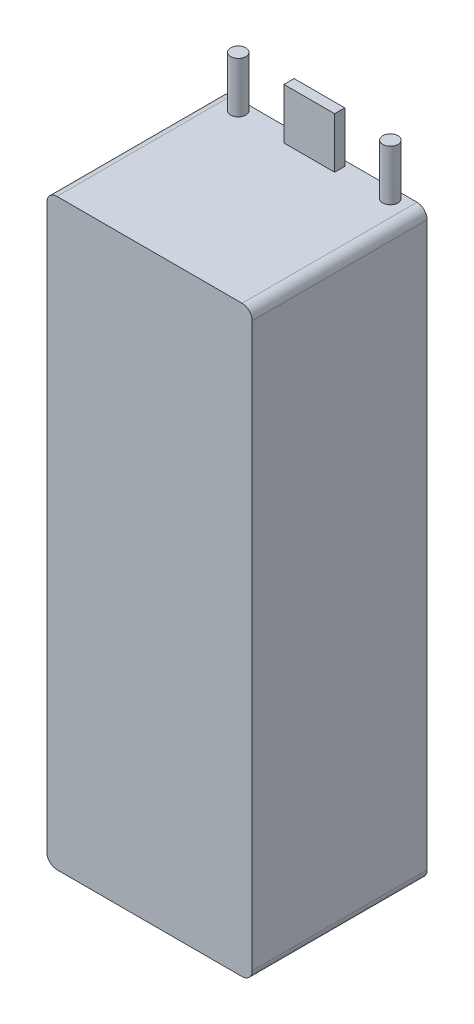
ISO-10303-21;
HEADER;
FILE_DESCRIPTION(('STEP AP214'),'2;1');
FILE_NAME('part.step','',(''),(''),'','','');
FILE_SCHEMA(('AUTOMOTIVE_DESIGN { 1 0 10303 214 1 1 1 1 }'));
ENDSEC;
DATA;
#1=APPLICATION_CONTEXT('core data for automotive mechanical design processes');
#2=APPLICATION_PROTOCOL_DEFINITION('international standard','automotive_design',2000,#1);
#3=PRODUCT_CONTEXT('',#1,'mechanical');
#4=PRODUCT('Part','Part','',(#3));
#5=PRODUCT_RELATED_PRODUCT_CATEGORY('part','',(#4));
#6=PRODUCT_DEFINITION_FORMATION('','',#4);
#7=PRODUCT_DEFINITION_CONTEXT('part definition',#1,'design');
#8=PRODUCT_DEFINITION('design','',#6,#7);
#9=PRODUCT_DEFINITION_SHAPE('','',#8);
#10=(LENGTH_UNIT() NAMED_UNIT(*) SI_UNIT(.MILLI.,.METRE.));
#11=(NAMED_UNIT(*) PLANE_ANGLE_UNIT() SI_UNIT($,.RADIAN.));
#12=(NAMED_UNIT(*) SI_UNIT($,.STERADIAN.) SOLID_ANGLE_UNIT());
#13=UNCERTAINTY_MEASURE_WITH_UNIT(LENGTH_MEASURE(1.E-05),#10,'distance_accuracy_value','');
#14=(GEOMETRIC_REPRESENTATION_CONTEXT(3) GLOBAL_UNCERTAINTY_ASSIGNED_CONTEXT((#13)) GLOBAL_UNIT_ASSIGNED_CONTEXT((#10,
#11,#12)) REPRESENTATION_CONTEXT('',''));
#15=CARTESIAN_POINT('',(0.,0.,0.));
#16=DIRECTION('',(0.,0.,1.));
#17=DIRECTION('',(1.,0.,0.));
#18=AXIS2_PLACEMENT_3D('',#15,#16,#17);
#19=CARTESIAN_POINT('',(0.,115.,0.));
#20=DIRECTION('',(0.,-1.,0.));
#21=DIRECTION('',(0.,0.,-1.));
#22=AXIS2_PLACEMENT_3D('',#19,#20,#21);
#23=PLANE('',#22);
#24=DIRECTION('',(1.,0.,0.));
#25=VECTOR('',#24,1.);
#26=CARTESIAN_POINT('',(-20.25,115.,17.25));
#27=LINE('',#26,#25);
#28=CARTESIAN_POINT('',(-18.25,115.,17.25));
#29=VERTEX_POINT('',#28);
#30=CARTESIAN_POINT('',(18.25,115.,17.25));
#31=VERTEX_POINT('',#30);
#32=EDGE_CURVE('E165',#29,#31,#27,.T.);
#33=ORIENTED_EDGE('',*,*,#32,.T.);
#34=DIRECTION('',(0.,0.,-1.));
#35=VECTOR('',#34,1.);
#36=CARTESIAN_POINT('',(18.25,115.,0.));
#37=LINE('',#36,#35);
#38=CARTESIAN_POINT('',(18.25,115.,-17.25));
#39=VERTEX_POINT('',#38);
#40=EDGE_CURVE('E193',#31,#39,#37,.T.);
#41=ORIENTED_EDGE('',*,*,#40,.T.);
#42=DIRECTION('',(-1.,0.,0.));
#43=VECTOR('',#42,1.);
#44=CARTESIAN_POINT('',(-20.25,115.,-17.25));
#45=LINE('',#44,#43);
#46=CARTESIAN_POINT('',(-18.25,115.,-17.25));
#47=VERTEX_POINT('',#46);
#48=EDGE_CURVE('E162',#39,#47,#45,.T.);
#49=ORIENTED_EDGE('',*,*,#48,.T.);
#50=DIRECTION('',(0.,0.,1.));
#51=VECTOR('',#50,1.);
#52=CARTESIAN_POINT('',(-18.25,115.,0.));
#53=LINE('',#52,#51);
#54=EDGE_CURVE('E190',#47,#29,#53,.T.);
#55=ORIENTED_EDGE('',*,*,#54,.T.);
#56=EDGE_LOOP('',(#33,#41,#49,#55));
#57=FACE_BOUND('',#56,.T.);
#58=CARTESIAN_POINT('',(-15.,115.,-15.25));
#59=DIRECTION('',(0.,-1.,0.));
#60=DIRECTION('',(0.,0.,-1.));
#61=AXIS2_PLACEMENT_3D('',#58,#59,#60);
#62=CIRCLE('',#61,1.5);
#63=CARTESIAN_POINT('',(-15.,115.,-16.75));
#64=VERTEX_POINT('',#63);
#65=EDGE_CURVE('E184',#64,#64,#62,.F.);
#66=ORIENTED_EDGE('',*,*,#65,.F.);
#67=EDGE_LOOP('',(#66));
#68=FACE_BOUND('',#67,.T.);
#69=CARTESIAN_POINT('',(15.,115.,-15.25));
#70=DIRECTION('',(0.,-1.,0.));
#71=DIRECTION('',(0.,0.,-1.));
#72=AXIS2_PLACEMENT_3D('',#69,#70,#71);
#73=CIRCLE('',#72,1.5);
#74=CARTESIAN_POINT('',(15.,115.,-16.75));
#75=VERTEX_POINT('',#74);
#76=EDGE_CURVE('E187',#75,#75,#73,.F.);
#77=ORIENTED_EDGE('',*,*,#76,.F.);
#78=EDGE_LOOP('',(#77));
#79=FACE_BOUND('',#78,.T.);
#80=DIRECTION('',(0.,0.,-1.));
#81=VECTOR('',#80,1.);
#82=CARTESIAN_POINT('',(4.99999999999999,115.,-16.25));
#83=LINE('',#82,#81);
#84=CARTESIAN_POINT('',(4.99999999999999,115.,-14.25));
#85=VERTEX_POINT('',#84);
#86=CARTESIAN_POINT('',(4.99999999999999,115.,-16.25));
#87=VERTEX_POINT('',#86);
#88=EDGE_CURVE('E149',#85,#87,#83,.T.);
#89=ORIENTED_EDGE('',*,*,#88,.F.);
#90=DIRECTION('',(1.,0.,0.));
#91=VECTOR('',#90,1.);
#92=CARTESIAN_POINT('',(-5.00000000000001,115.,-14.25));
#93=LINE('',#92,#91);
#94=CARTESIAN_POINT('',(-5.00000000000001,115.,-14.25));
#95=VERTEX_POINT('',#94);
#96=EDGE_CURVE('E146',#95,#85,#93,.T.);
#97=ORIENTED_EDGE('',*,*,#96,.F.);
#98=DIRECTION('',(0.,0.,1.));
#99=VECTOR('',#98,1.);
#100=CARTESIAN_POINT('',(-5.00000000000001,115.,-16.25));
#101=LINE('',#100,#99);
#102=CARTESIAN_POINT('',(-5.00000000000001,115.,-16.25));
#103=VERTEX_POINT('',#102);
#104=EDGE_CURVE('E427',#103,#95,#101,.T.);
#105=ORIENTED_EDGE('',*,*,#104,.F.);
#106=DIRECTION('',(-1.,0.,0.));
#107=VECTOR('',#106,1.);
#108=CARTESIAN_POINT('',(-5.00000000000001,115.,-16.25));
#109=LINE('',#108,#107);
#110=EDGE_CURVE('E433',#87,#103,#109,.T.);
#111=ORIENTED_EDGE('',*,*,#110,.F.);
#112=EDGE_LOOP('',(#89,#97,#105,#111));
#113=FACE_BOUND('',#112,.T.);
#114=ADVANCED_FACE('F35',(#57,#68,#79,#113),#23,.F.);
#115=CARTESIAN_POINT('',(20.25,115.,17.25));
#116=DIRECTION('',(-1.,0.,0.));
#117=DIRECTION('',(0.,0.,1.));
#118=AXIS2_PLACEMENT_3D('',#115,#116,#117);
#119=PLANE('',#118);
#120=DIRECTION('',(0.,-1.,0.));
#121=VECTOR('',#120,1.);
#122=CARTESIAN_POINT('',(20.25,115.,-17.25));
#123=LINE('',#122,#121);
#124=CARTESIAN_POINT('',(20.25,113.,-17.25));
#125=VERTEX_POINT('',#124);
#126=CARTESIAN_POINT('',(20.25,2.,-17.25));
#127=VERTEX_POINT('',#126);
#128=EDGE_CURVE('E181',#125,#127,#123,.T.);
#129=ORIENTED_EDGE('',*,*,#128,.F.);
#130=DIRECTION('',(0.,0.,-1.));
#131=VECTOR('',#130,1.);
#132=CARTESIAN_POINT('',(20.25,113.,17.25));
#133=LINE('',#132,#131);
#134=CARTESIAN_POINT('',(20.25,113.,17.25));
#135=VERTEX_POINT('',#134);
#136=EDGE_CURVE('E207',#125,#135,#133,.F.);
#137=ORIENTED_EDGE('',*,*,#136,.T.);
#138=DIRECTION('',(0.,-1.,0.));
#139=VECTOR('',#138,1.);
#140=CARTESIAN_POINT('',(20.25,115.,17.25));
#141=LINE('',#140,#139);
#142=CARTESIAN_POINT('',(20.25,2.,17.25));
#143=VERTEX_POINT('',#142);
#144=EDGE_CURVE('E169',#135,#143,#141,.T.);
#145=ORIENTED_EDGE('',*,*,#144,.T.);
#146=DIRECTION('',(0.,0.,-1.));
#147=VECTOR('',#146,1.);
#148=CARTESIAN_POINT('',(20.25,2.,-17.25));
#149=LINE('',#148,#147);
#150=EDGE_CURVE('E204',#143,#127,#149,.T.);
#151=ORIENTED_EDGE('',*,*,#150,.T.);
#152=EDGE_LOOP('',(#129,#137,#145,#151));
#153=FACE_BOUND('',#152,.T.);
#154=ADVANCED_FACE('F239',(#153),#119,.F.);
#155=CARTESIAN_POINT('',(-20.25,115.,-17.25));
#156=DIRECTION('',(0.,0.,1.));
#157=DIRECTION('',(1.,0.,0.));
#158=AXIS2_PLACEMENT_3D('',#155,#156,#157);
#159=PLANE('',#158);
#160=ORIENTED_EDGE('',*,*,#48,.F.);
#161=CARTESIAN_POINT('',(18.25,113.,-17.25));
#162=DIRECTION('',(0.,0.,1.));
#163=DIRECTION('',(1.,0.,0.));
#164=AXIS2_PLACEMENT_3D('',#161,#162,#163);
#165=CIRCLE('',#164,2.);
#166=EDGE_CURVE('E202',#39,#125,#165,.F.);
#167=ORIENTED_EDGE('',*,*,#166,.T.);
#168=ORIENTED_EDGE('',*,*,#128,.T.);
#169=CARTESIAN_POINT('',(18.25,2.,-17.25));
#170=DIRECTION('',(0.,0.,1.));
#171=DIRECTION('',(1.,0.,0.));
#172=AXIS2_PLACEMENT_3D('',#169,#170,#171);
#173=CIRCLE('',#172,2.);
#174=CARTESIAN_POINT('',(18.25,0.,-17.25));
#175=VERTEX_POINT('',#174);
#176=EDGE_CURVE('E198',#127,#175,#173,.F.);
#177=ORIENTED_EDGE('',*,*,#176,.T.);
#178=DIRECTION('',(-1.,0.,0.));
#179=VECTOR('',#178,1.);
#180=CARTESIAN_POINT('',(-20.25,0.,-17.25));
#181=LINE('',#180,#179);
#182=CARTESIAN_POINT('',(-18.25,0.,-17.25));
#183=VERTEX_POINT('',#182);
#184=EDGE_CURVE('E161',#175,#183,#181,.T.);
#185=ORIENTED_EDGE('',*,*,#184,.T.);
#186=CARTESIAN_POINT('',(-18.25,2.,-17.25));
#187=DIRECTION('',(0.,0.,1.));
#188=DIRECTION('',(1.,0.,0.));
#189=AXIS2_PLACEMENT_3D('',#186,#187,#188);
#190=CIRCLE('',#189,2.);
#191=CARTESIAN_POINT('',(-20.25,2.,-17.25));
#192=VERTEX_POINT('',#191);
#193=EDGE_CURVE('E196',#183,#192,#190,.F.);
#194=ORIENTED_EDGE('',*,*,#193,.T.);
#195=DIRECTION('',(0.,-1.,0.));
#196=VECTOR('',#195,1.);
#197=CARTESIAN_POINT('',(-20.25,115.,-17.25));
#198=LINE('',#197,#196);
#199=CARTESIAN_POINT('',(-20.25,113.,-17.25));
#200=VERTEX_POINT('',#199);
#201=EDGE_CURVE('E178',#200,#192,#198,.T.);
#202=ORIENTED_EDGE('',*,*,#201,.F.);
#203=CARTESIAN_POINT('',(-18.25,113.,-17.25));
#204=DIRECTION('',(0.,0.,1.));
#205=DIRECTION('',(1.,0.,0.));
#206=AXIS2_PLACEMENT_3D('',#203,#204,#205);
#207=CIRCLE('',#206,2.);
#208=EDGE_CURVE('E200',#200,#47,#207,.F.);
#209=ORIENTED_EDGE('',*,*,#208,.T.);
#210=EDGE_LOOP('',(#160,#167,#168,#177,#185,#194,#202,#209));
#211=FACE_BOUND('',#210,.T.);
#212=ADVANCED_FACE('F226',(#211),#159,.F.);
#213=CARTESIAN_POINT('',(-20.25,115.,17.25));
#214=DIRECTION('',(1.,0.,0.));
#215=DIRECTION('',(0.,0.,-1.));
#216=AXIS2_PLACEMENT_3D('',#213,#214,#215);
#217=PLANE('',#216);
#218=DIRECTION('',(0.,-1.,0.));
#219=VECTOR('',#218,1.);
#220=CARTESIAN_POINT('',(-20.25,115.,17.25));
#221=LINE('',#220,#219);
#222=CARTESIAN_POINT('',(-20.25,113.,17.25));
#223=VERTEX_POINT('',#222);
#224=CARTESIAN_POINT('',(-20.25,2.,17.25));
#225=VERTEX_POINT('',#224);
#226=EDGE_CURVE('E176',#223,#225,#221,.T.);
#227=ORIENTED_EDGE('',*,*,#226,.F.);
#228=DIRECTION('',(0.,0.,1.));
#229=VECTOR('',#228,1.);
#230=CARTESIAN_POINT('',(-20.25,113.,17.25));
#231=LINE('',#230,#229);
#232=EDGE_CURVE('E217',#223,#200,#231,.F.);
#233=ORIENTED_EDGE('',*,*,#232,.T.);
#234=ORIENTED_EDGE('',*,*,#201,.T.);
#235=DIRECTION('',(0.,0.,1.));
#236=VECTOR('',#235,1.);
#237=CARTESIAN_POINT('',(-20.25,2.,17.25));
#238=LINE('',#237,#236);
#239=EDGE_CURVE('E215',#192,#225,#238,.T.);
#240=ORIENTED_EDGE('',*,*,#239,.T.);
#241=EDGE_LOOP('',(#227,#233,#234,#240));
#242=FACE_BOUND('',#241,.T.);
#243=ADVANCED_FACE('F229',(#242),#217,.F.);
#244=CARTESIAN_POINT('',(-20.25,115.,17.25));
#245=DIRECTION('',(0.,0.,-1.));
#246=DIRECTION('',(-1.,0.,0.));
#247=AXIS2_PLACEMENT_3D('',#244,#245,#246);
#248=PLANE('',#247);
#249=ORIENTED_EDGE('',*,*,#144,.F.);
#250=CARTESIAN_POINT('',(18.25,113.,17.25));
#251=DIRECTION('',(0.,0.,-1.));
#252=DIRECTION('',(-1.,0.,0.));
#253=AXIS2_PLACEMENT_3D('',#250,#251,#252);
#254=CIRCLE('',#253,2.);
#255=EDGE_CURVE('E213',#135,#31,#254,.F.);
#256=ORIENTED_EDGE('',*,*,#255,.T.);
#257=ORIENTED_EDGE('',*,*,#32,.F.);
#258=CARTESIAN_POINT('',(-18.25,113.,17.25));
#259=DIRECTION('',(0.,0.,-1.));
#260=DIRECTION('',(-1.,0.,0.));
#261=AXIS2_PLACEMENT_3D('',#258,#259,#260);
#262=CIRCLE('',#261,2.);
#263=EDGE_CURVE('E58',#29,#223,#262,.F.);
#264=ORIENTED_EDGE('',*,*,#263,.T.);
#265=ORIENTED_EDGE('',*,*,#226,.T.);
#266=CARTESIAN_POINT('',(-18.25,2.,17.25));
#267=DIRECTION('',(0.,0.,-1.));
#268=DIRECTION('',(-1.,0.,0.));
#269=AXIS2_PLACEMENT_3D('',#266,#267,#268);
#270=CIRCLE('',#269,2.);
#271=CARTESIAN_POINT('',(-18.25,0.,17.25));
#272=VERTEX_POINT('',#271);
#273=EDGE_CURVE('E50',#225,#272,#270,.F.);
#274=ORIENTED_EDGE('',*,*,#273,.T.);
#275=DIRECTION('',(1.,0.,0.));
#276=VECTOR('',#275,1.);
#277=CARTESIAN_POINT('',(-20.25,0.,17.25));
#278=LINE('',#277,#276);
#279=CARTESIAN_POINT('',(18.25,0.,17.25));
#280=VERTEX_POINT('',#279);
#281=EDGE_CURVE('E166',#272,#280,#278,.T.);
#282=ORIENTED_EDGE('',*,*,#281,.T.);
#283=CARTESIAN_POINT('',(18.25,2.,17.25));
#284=DIRECTION('',(0.,0.,-1.));
#285=DIRECTION('',(-1.,0.,0.));
#286=AXIS2_PLACEMENT_3D('',#283,#284,#285);
#287=CIRCLE('',#286,2.);
#288=EDGE_CURVE('E210',#280,#143,#287,.F.);
#289=ORIENTED_EDGE('',*,*,#288,.T.);
#290=EDGE_LOOP('',(#249,#256,#257,#264,#265,#274,#282,#289));
#291=FACE_BOUND('',#290,.T.);
#292=ADVANCED_FACE('F232',(#291),#248,.F.);
#293=CARTESIAN_POINT('',(0.,0.,0.));
#294=DIRECTION('',(0.,-1.,0.));
#295=DIRECTION('',(0.,0.,-1.));
#296=AXIS2_PLACEMENT_3D('',#293,#294,#295);
#297=PLANE('',#296);
#298=ORIENTED_EDGE('',*,*,#184,.F.);
#299=DIRECTION('',(0.,0.,-1.));
#300=VECTOR('',#299,1.);
#301=CARTESIAN_POINT('',(18.25,0.,17.25));
#302=LINE('',#301,#300);
#303=EDGE_CURVE('E11',#175,#280,#302,.F.);
#304=ORIENTED_EDGE('',*,*,#303,.T.);
#305=ORIENTED_EDGE('',*,*,#281,.F.);
#306=DIRECTION('',(0.,0.,1.));
#307=VECTOR('',#306,1.);
#308=CARTESIAN_POINT('',(-18.25,0.,-17.25));
#309=LINE('',#308,#307);
#310=EDGE_CURVE('E43',#272,#183,#309,.F.);
#311=ORIENTED_EDGE('',*,*,#310,.T.);
#312=EDGE_LOOP('',(#298,#304,#305,#311));
#313=FACE_BOUND('',#312,.T.);
#314=ADVANCED_FACE('F221',(#313),#297,.T.);
#315=CARTESIAN_POINT('',(-15.,125.,-15.25));
#316=DIRECTION('',(0.,-1.,0.));
#317=DIRECTION('',(0.,0.,-1.));
#318=AXIS2_PLACEMENT_3D('',#315,#316,#317);
#319=CYLINDRICAL_SURFACE('',#318,1.5);
#320=CARTESIAN_POINT('',(-15.,125.,-15.25));
#321=DIRECTION('',(0.,1.,0.));
#322=DIRECTION('',(0.,0.,1.));
#323=AXIS2_PLACEMENT_3D('',#320,#321,#322);
#324=CIRCLE('',#323,1.5);
#325=CARTESIAN_POINT('',(-15.,125.,-13.75));
#326=VERTEX_POINT('',#325);
#327=EDGE_CURVE('E153',#326,#326,#324,.T.);
#328=ORIENTED_EDGE('',*,*,#327,.F.);
#329=EDGE_LOOP('',(#328));
#330=FACE_BOUND('',#329,.T.);
#331=ORIENTED_EDGE('',*,*,#65,.T.);
#332=EDGE_LOOP('',(#331));
#333=FACE_BOUND('',#332,.T.);
#334=ADVANCED_FACE('F266',(#330,#333),#319,.T.);
#335=CARTESIAN_POINT('',(-15.,125.,-15.25));
#336=DIRECTION('',(0.,1.,0.));
#337=DIRECTION('',(0.,0.,1.));
#338=AXIS2_PLACEMENT_3D('',#335,#336,#337);
#339=PLANE('',#338);
#340=ORIENTED_EDGE('',*,*,#327,.T.);
#341=EDGE_LOOP('',(#340));
#342=FACE_BOUND('',#341,.T.);
#343=ADVANCED_FACE('F298',(#342),#339,.T.);
#344=CARTESIAN_POINT('',(15.,125.,-15.25));
#345=DIRECTION('',(0.,-1.,0.));
#346=DIRECTION('',(0.,0.,-1.));
#347=AXIS2_PLACEMENT_3D('',#344,#345,#346);
#348=CYLINDRICAL_SURFACE('',#347,1.5);
#349=CARTESIAN_POINT('',(15.,125.,-15.25));
#350=DIRECTION('',(0.,1.,0.));
#351=DIRECTION('',(0.,0.,1.));
#352=AXIS2_PLACEMENT_3D('',#349,#350,#351);
#353=CIRCLE('',#352,1.5);
#354=CARTESIAN_POINT('',(15.,125.,-13.75));
#355=VERTEX_POINT('',#354);
#356=EDGE_CURVE('E150',#355,#355,#353,.T.);
#357=ORIENTED_EDGE('',*,*,#356,.F.);
#358=EDGE_LOOP('',(#357));
#359=FACE_BOUND('',#358,.T.);
#360=ORIENTED_EDGE('',*,*,#76,.T.);
#361=EDGE_LOOP('',(#360));
#362=FACE_BOUND('',#361,.T.);
#363=ADVANCED_FACE('F306',(#359,#362),#348,.T.);
#364=CARTESIAN_POINT('',(15.,125.,-15.25));
#365=DIRECTION('',(0.,1.,0.));
#366=DIRECTION('',(0.,0.,1.));
#367=AXIS2_PLACEMENT_3D('',#364,#365,#366);
#368=PLANE('',#367);
#369=ORIENTED_EDGE('',*,*,#356,.T.);
#370=EDGE_LOOP('',(#369));
#371=FACE_BOUND('',#370,.T.);
#372=ADVANCED_FACE('F312',(#371),#368,.T.);
#373=CARTESIAN_POINT('',(4.99999999999999,125.,-16.25));
#374=DIRECTION('',(-1.,0.,0.));
#375=DIRECTION('',(0.,0.,1.));
#376=AXIS2_PLACEMENT_3D('',#373,#374,#375);
#377=PLANE('',#376);
#378=ORIENTED_EDGE('',*,*,#88,.T.);
#379=DIRECTION('',(0.,-1.,0.));
#380=VECTOR('',#379,1.);
#381=CARTESIAN_POINT('',(4.99999999999999,125.,-16.25));
#382=LINE('',#381,#380);
#383=CARTESIAN_POINT('',(4.99999999999999,125.,-16.25));
#384=VERTEX_POINT('',#383);
#385=EDGE_CURVE('E130',#384,#87,#382,.T.);
#386=ORIENTED_EDGE('',*,*,#385,.F.);
#387=DIRECTION('',(0.,0.,-1.));
#388=VECTOR('',#387,1.);
#389=CARTESIAN_POINT('',(4.99999999999999,125.,-16.25));
#390=LINE('',#389,#388);
#391=CARTESIAN_POINT('',(4.99999999999999,125.,-14.25));
#392=VERTEX_POINT('',#391);
#393=EDGE_CURVE('E137',#392,#384,#390,.T.);
#394=ORIENTED_EDGE('',*,*,#393,.F.);
#395=DIRECTION('',(0.,-1.,0.));
#396=VECTOR('',#395,1.);
#397=CARTESIAN_POINT('',(4.99999999999999,125.,-14.25));
#398=LINE('',#397,#396);
#399=EDGE_CURVE('E423',#392,#85,#398,.T.);
#400=ORIENTED_EDGE('',*,*,#399,.T.);
#401=EDGE_LOOP('',(#378,#386,#394,#400));
#402=FACE_BOUND('',#401,.T.);
#403=ADVANCED_FACE('F148',(#402),#377,.F.);
#404=CARTESIAN_POINT('',(-5.00000000000001,125.,-16.25));
#405=DIRECTION('',(0.,0.,1.));
#406=DIRECTION('',(1.,0.,0.));
#407=AXIS2_PLACEMENT_3D('',#404,#405,#406);
#408=PLANE('',#407);
#409=ORIENTED_EDGE('',*,*,#110,.T.);
#410=DIRECTION('',(0.,-1.,0.));
#411=VECTOR('',#410,1.);
#412=CARTESIAN_POINT('',(-5.00000000000001,125.,-16.25));
#413=LINE('',#412,#411);
#414=CARTESIAN_POINT('',(-5.00000000000001,125.,-16.25));
#415=VERTEX_POINT('',#414);
#416=EDGE_CURVE('E133',#415,#103,#413,.T.);
#417=ORIENTED_EDGE('',*,*,#416,.F.);
#418=DIRECTION('',(-1.,0.,0.));
#419=VECTOR('',#418,1.);
#420=CARTESIAN_POINT('',(-5.00000000000001,125.,-16.25));
#421=LINE('',#420,#419);
#422=EDGE_CURVE('E125',#384,#415,#421,.T.);
#423=ORIENTED_EDGE('',*,*,#422,.F.);
#424=ORIENTED_EDGE('',*,*,#385,.T.);
#425=EDGE_LOOP('',(#409,#417,#423,#424));
#426=FACE_BOUND('',#425,.T.);
#427=ADVANCED_FACE('F128',(#426),#408,.F.);
#428=CARTESIAN_POINT('',(-5.00000000000001,125.,-16.25));
#429=DIRECTION('',(1.,0.,0.));
#430=DIRECTION('',(0.,0.,-1.));
#431=AXIS2_PLACEMENT_3D('',#428,#429,#430);
#432=PLANE('',#431);
#433=ORIENTED_EDGE('',*,*,#104,.T.);
#434=DIRECTION('',(0.,-1.,0.));
#435=VECTOR('',#434,1.);
#436=CARTESIAN_POINT('',(-5.00000000000001,125.,-14.25));
#437=LINE('',#436,#435);
#438=CARTESIAN_POINT('',(-5.00000000000001,125.,-14.25));
#439=VERTEX_POINT('',#438);
#440=EDGE_CURVE('E155',#439,#95,#437,.T.);
#441=ORIENTED_EDGE('',*,*,#440,.F.);
#442=DIRECTION('',(0.,0.,1.));
#443=VECTOR('',#442,1.);
#444=CARTESIAN_POINT('',(-5.00000000000001,125.,-16.25));
#445=LINE('',#444,#443);
#446=EDGE_CURVE('E136',#415,#439,#445,.T.);
#447=ORIENTED_EDGE('',*,*,#446,.F.);
#448=ORIENTED_EDGE('',*,*,#416,.T.);
#449=EDGE_LOOP('',(#433,#441,#447,#448));
#450=FACE_BOUND('',#449,.T.);
#451=ADVANCED_FACE('F333',(#450),#432,.F.);
#452=CARTESIAN_POINT('',(-5.00000000000001,125.,-14.25));
#453=DIRECTION('',(0.,0.,-1.));
#454=DIRECTION('',(-1.,0.,0.));
#455=AXIS2_PLACEMENT_3D('',#452,#453,#454);
#456=PLANE('',#455);
#457=ORIENTED_EDGE('',*,*,#96,.T.);
#458=ORIENTED_EDGE('',*,*,#399,.F.);
#459=DIRECTION('',(1.,0.,0.));
#460=VECTOR('',#459,1.);
#461=CARTESIAN_POINT('',(-5.00000000000001,125.,-14.25));
#462=LINE('',#461,#460);
#463=EDGE_CURVE('E142',#439,#392,#462,.T.);
#464=ORIENTED_EDGE('',*,*,#463,.F.);
#465=ORIENTED_EDGE('',*,*,#440,.T.);
#466=EDGE_LOOP('',(#457,#458,#464,#465));
#467=FACE_BOUND('',#466,.T.);
#468=ADVANCED_FACE('F340',(#467),#456,.F.);
#469=CARTESIAN_POINT('',(0.,125.,0.));
#470=DIRECTION('',(0.,1.,0.));
#471=DIRECTION('',(0.,0.,1.));
#472=AXIS2_PLACEMENT_3D('',#469,#470,#471);
#473=PLANE('',#472);
#474=ORIENTED_EDGE('',*,*,#393,.T.);
#475=ORIENTED_EDGE('',*,*,#422,.T.);
#476=ORIENTED_EDGE('',*,*,#446,.T.);
#477=ORIENTED_EDGE('',*,*,#463,.T.);
#478=EDGE_LOOP('',(#474,#475,#476,#477));
#479=FACE_BOUND('',#478,.T.);
#480=ADVANCED_FACE('F140',(#479),#473,.T.);
#481=CARTESIAN_POINT('',(18.25,113.,0.));
#482=DIRECTION('',(0.,0.,-1.));
#483=DIRECTION('',(-1.,0.,0.));
#484=AXIS2_PLACEMENT_3D('',#481,#482,#483);
#485=CYLINDRICAL_SURFACE('',#484,2.);
#486=ORIENTED_EDGE('',*,*,#255,.F.);
#487=ORIENTED_EDGE('',*,*,#136,.F.);
#488=ORIENTED_EDGE('',*,*,#166,.F.);
#489=ORIENTED_EDGE('',*,*,#40,.F.);
#490=EDGE_LOOP('',(#486,#487,#488,#489));
#491=FACE_BOUND('',#490,.T.);
#492=ADVANCED_FACE('F244',(#491),#485,.T.);
#493=CARTESIAN_POINT('',(-18.25,113.,0.));
#494=DIRECTION('',(0.,0.,1.));
#495=DIRECTION('',(1.,0.,0.));
#496=AXIS2_PLACEMENT_3D('',#493,#494,#495);
#497=CYLINDRICAL_SURFACE('',#496,2.);
#498=ORIENTED_EDGE('',*,*,#208,.F.);
#499=ORIENTED_EDGE('',*,*,#232,.F.);
#500=ORIENTED_EDGE('',*,*,#263,.F.);
#501=ORIENTED_EDGE('',*,*,#54,.F.);
#502=EDGE_LOOP('',(#498,#499,#500,#501));
#503=FACE_BOUND('',#502,.T.);
#504=ADVANCED_FACE('F250',(#503),#497,.T.);
#505=CARTESIAN_POINT('',(18.25,2.,17.25));
#506=DIRECTION('',(0.,0.,1.));
#507=DIRECTION('',(1.,0.,0.));
#508=AXIS2_PLACEMENT_3D('',#505,#506,#507);
#509=CYLINDRICAL_SURFACE('',#508,2.);
#510=ORIENTED_EDGE('',*,*,#288,.F.);
#511=ORIENTED_EDGE('',*,*,#303,.F.);
#512=ORIENTED_EDGE('',*,*,#176,.F.);
#513=ORIENTED_EDGE('',*,*,#150,.F.);
#514=EDGE_LOOP('',(#510,#511,#512,#513));
#515=FACE_BOUND('',#514,.T.);
#516=ADVANCED_FACE('F236',(#515),#509,.T.);
#517=CARTESIAN_POINT('',(-18.25,2.,17.25));
#518=DIRECTION('',(0.,0.,-1.));
#519=DIRECTION('',(-1.,0.,0.));
#520=AXIS2_PLACEMENT_3D('',#517,#518,#519);
#521=CYLINDRICAL_SURFACE('',#520,2.);
#522=ORIENTED_EDGE('',*,*,#193,.F.);
#523=ORIENTED_EDGE('',*,*,#310,.F.);
#524=ORIENTED_EDGE('',*,*,#273,.F.);
#525=ORIENTED_EDGE('',*,*,#239,.F.);
#526=EDGE_LOOP('',(#522,#523,#524,#525));
#527=FACE_BOUND('',#526,.T.);
#528=ADVANCED_FACE('F37',(#527),#521,.T.);
#529=CLOSED_SHELL('',(#114,#154,#212,#243,#292,#314,#334,#343,#363,#372,#403,#427,#451,#468,
#480,#492,#504,#516,#528));
#530=MANIFOLD_SOLID_BREP('B2',#529);
#531=ADVANCED_BREP_SHAPE_REPRESENTATION('',(#18,#530),#14);
#532=SHAPE_DEFINITION_REPRESENTATION(#9,#531);
ENDSEC;
END-ISO-10303-21;
